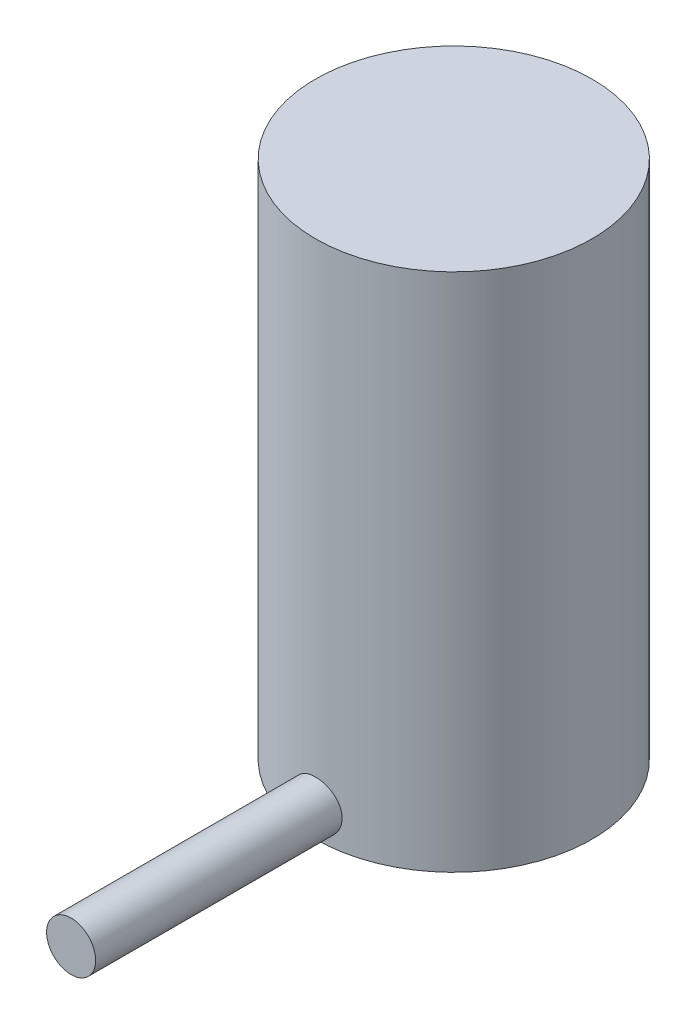
ISO-10303-21;
HEADER;
FILE_DESCRIPTION(('STEP AP214'),'2;1');
FILE_NAME('part.step','',(''),(''),'','','');
FILE_SCHEMA(('AUTOMOTIVE_DESIGN { 1 0 10303 214 1 1 1 1 }'));
ENDSEC;
DATA;
#1=APPLICATION_CONTEXT('core data for automotive mechanical design processes');
#2=APPLICATION_PROTOCOL_DEFINITION('international standard','automotive_design',2000,#1);
#3=PRODUCT_CONTEXT('',#1,'mechanical');
#4=PRODUCT('Part','Part','',(#3));
#5=PRODUCT_RELATED_PRODUCT_CATEGORY('part','',(#4));
#6=PRODUCT_DEFINITION_FORMATION('','',#4);
#7=PRODUCT_DEFINITION_CONTEXT('part definition',#1,'design');
#8=PRODUCT_DEFINITION('design','',#6,#7);
#9=PRODUCT_DEFINITION_SHAPE('','',#8);
#10=(LENGTH_UNIT() NAMED_UNIT(*) SI_UNIT(.MILLI.,.METRE.));
#11=(NAMED_UNIT(*) PLANE_ANGLE_UNIT() SI_UNIT($,.RADIAN.));
#12=(NAMED_UNIT(*) SI_UNIT($,.STERADIAN.) SOLID_ANGLE_UNIT());
#13=UNCERTAINTY_MEASURE_WITH_UNIT(LENGTH_MEASURE(1.E-05),#10,'distance_accuracy_value','');
#14=(GEOMETRIC_REPRESENTATION_CONTEXT(3) GLOBAL_UNCERTAINTY_ASSIGNED_CONTEXT((#13)) GLOBAL_UNIT_ASSIGNED_CONTEXT((#10,
#11,#12)) REPRESENTATION_CONTEXT('',''));
#15=CARTESIAN_POINT('',(0.,0.,0.));
#16=DIRECTION('',(0.,0.,1.));
#17=DIRECTION('',(1.,0.,0.));
#18=AXIS2_PLACEMENT_3D('',#15,#16,#17);
#19=CARTESIAN_POINT('',(0.,69.85,0.));
#20=DIRECTION('',(0.,-1.,0.));
#21=DIRECTION('',(0.,0.,-1.));
#22=AXIS2_PLACEMENT_3D('',#19,#20,#21);
#23=CYLINDRICAL_SURFACE('',#22,17.907);
#24=CARTESIAN_POINT('',(-3.175,6.35,17.6232807388409));
#25=CARTESIAN_POINT('',(-3.17499304653299,6.17316931234915,17.6232840588216));
#26=CARTESIAN_POINT('',(-3.16017712443954,5.9962462998669,17.6259710704368));
#27=CARTESIAN_POINT('',(-3.10133767584991,5.64737664528669,17.6364172256658));
#28=CARTESIAN_POINT('',(-3.05728828655829,5.47543455050016,17.6441808604694));
#29=CARTESIAN_POINT('',(-2.94136669140707,5.14162558179383,17.6638739499538));
#30=CARTESIAN_POINT('',(-2.86951905862502,4.97974995560714,17.6757997244788));
#31=CARTESIAN_POINT('',(-2.70010367702674,4.67036437748602,17.7024690092104));
#32=CARTESIAN_POINT('',(-2.60253838004757,4.522853057941,17.7172122507723));
#33=CARTESIAN_POINT('',(-2.38329824870293,4.24472578489295,17.7480387653565));
#34=CARTESIAN_POINT('',(-2.26139257747385,4.11429308671363,17.7641339406865));
#35=CARTESIAN_POINT('',(-1.99743106562776,3.87561974028662,17.7957453784286));
#36=CARTESIAN_POINT('',(-1.8553739690473,3.76738047630226,17.8112616046808));
#37=CARTESIAN_POINT('',(-1.55394641373776,3.57547140900495,17.8400936443133));
#38=CARTESIAN_POINT('',(-1.39446502609843,3.49197328821361,17.8533938139724));
#39=CARTESIAN_POINT('',(-1.06346376226366,3.35302149639506,17.8761623277342));
#40=CARTESIAN_POINT('',(-0.891944772257165,3.29756576339345,17.8856309535624));
#41=CARTESIAN_POINT('',(-0.543633444685128,3.21683655393841,17.8995854743215));
#42=CARTESIAN_POINT('',(-0.366914669516718,3.19125462842236,17.9041222564799));
#43=CARTESIAN_POINT('',(-0.0116389612561523,3.17003910378455,17.9078770335711));
#44=CARTESIAN_POINT('',(0.166917830155896,3.17440321333489,17.907095435441));
#45=CARTESIAN_POINT('',(0.51868889671369,3.21271731051247,17.9003415428904));
#46=CARTESIAN_POINT('',(0.69194061553601,3.24633526372394,17.8944275042702));
#47=CARTESIAN_POINT('',(1.03030433215328,3.34167877912638,17.8781383576456));
#48=CARTESIAN_POINT('',(1.19541605696335,3.40340528326307,17.8677631001421));
#49=CARTESIAN_POINT('',(1.5137882184124,3.55353690544315,17.8436189668841));
#50=CARTESIAN_POINT('',(1.66698374919448,3.64207680550016,17.8298330123166));
#51=CARTESIAN_POINT('',(1.95646773029609,3.84322287934474,17.8003956620947));
#52=CARTESIAN_POINT('',(2.09275463541591,3.95583125008002,17.7847440962067));
#53=CARTESIAN_POINT('',(2.34651726351147,4.2037534862625,17.753059225458));
#54=CARTESIAN_POINT('',(2.46370920050088,4.33935771053015,17.7370236294536));
#55=CARTESIAN_POINT('',(2.67372570594686,4.62844955837823,17.7065845193159));
#56=CARTESIAN_POINT('',(2.7665499883125,4.78193739189243,17.6921810243455));
#57=CARTESIAN_POINT('',(2.92526441219525,5.1027919496566,17.6666346364363));
#58=CARTESIAN_POINT('',(2.99111688547113,5.27017769396306,17.6554963096858));
#59=CARTESIAN_POINT('',(3.09368765152384,5.61387799299758,17.637813960262));
#60=CARTESIAN_POINT('',(3.13040887159515,5.79019164869743,17.6312694759778));
#61=CARTESIAN_POINT('',(3.1732678554583,6.14419386746262,17.6236061533231));
#62=CARTESIAN_POINT('',(3.17981173185862,6.32183175096055,17.6224152741667));
#63=CARTESIAN_POINT('',(3.16321568256925,6.6756631566073,17.6254016696905));
#64=CARTESIAN_POINT('',(3.14007706189475,6.85185674191313,17.6295787083657));
#65=CARTESIAN_POINT('',(3.06512029278095,7.19648571132991,17.642763461987));
#66=CARTESIAN_POINT('',(3.01351192219463,7.36496819502465,17.6517358279197));
#67=CARTESIAN_POINT('',(2.88330190750668,7.69089399503557,17.6734702251741));
#68=CARTESIAN_POINT('',(2.8046984600463,7.84833657300386,17.686232509667));
#69=CARTESIAN_POINT('',(2.62178291384613,8.1495116980542,17.7142744944614));
#70=CARTESIAN_POINT('',(2.51721240278218,8.29308495340304,17.7295789528698));
#71=CARTESIAN_POINT('',(2.2856826783338,8.56079261346665,17.7609098412996));
#72=CARTESIAN_POINT('',(2.15872167374103,8.68492546147473,17.7769363290059));
#73=CARTESIAN_POINT('',(1.88420838062045,8.91172858746286,17.808135180661));
#74=CARTESIAN_POINT('',(1.73642975556229,9.01412688361611,17.8232951616733));
#75=CARTESIAN_POINT('',(1.42553116004289,9.19264196648693,17.850849525764));
#76=CARTESIAN_POINT('',(1.26241173478047,9.26875968674476,17.8632440070732));
#77=CARTESIAN_POINT('',(0.92624173568632,9.39213762546823,17.8838173112094));
#78=CARTESIAN_POINT('',(0.753243080112901,9.43953580523299,17.8920162582669));
#79=CARTESIAN_POINT('',(0.401582814043976,9.50457158937726,17.9033601632873));
#80=CARTESIAN_POINT('',(0.22292173532396,9.52221198001414,17.9065055944156));
#81=CARTESIAN_POINT('',(-0.132375185143442,9.52714288628866,17.907380024155));
#82=CARTESIAN_POINT('',(-0.309005257876593,9.51484569547592,17.9051826038283));
#83=CARTESIAN_POINT('',(-0.65764100323454,9.4611478518355,17.8957697718702));
#84=CARTESIAN_POINT('',(-0.829646710480001,9.41974741695451,17.8885543978169));
#85=CARTESIAN_POINT('',(-1.16396351255006,9.30918435653392,17.8699147285705));
#86=CARTESIAN_POINT('',(-1.32628801476777,9.24006120006895,17.8584964190245));
#87=CARTESIAN_POINT('',(-1.6370978172672,9.0760624106707,17.8326921353567));
#88=CARTESIAN_POINT('',(-1.78558232374656,8.98118530182147,17.8183059911646));
#89=CARTESIAN_POINT('',(-2.06656326384237,8.76693112821744,17.7879234415525));
#90=CARTESIAN_POINT('',(-2.19882900812823,8.64725409867942,17.771908674403));
#91=CARTESIAN_POINT('',(-2.44154473212556,8.38742369228863,17.7401952842498));
#92=CARTESIAN_POINT('',(-2.55198958929934,8.24726552081045,17.7244967362547));
#93=CARTESIAN_POINT('',(-2.7487637956448,7.94909197714427,17.6950545129417));
#94=CARTESIAN_POINT('',(-2.83488969736489,7.79094063684515,17.6813277758964));
#95=CARTESIAN_POINT('',(-2.97921615492176,7.46222861581149,17.6575851819714));
#96=CARTESIAN_POINT('',(-3.03744384893703,7.29168018124584,17.6475657209828));
#97=CARTESIAN_POINT('',(-3.11207588901382,6.99212062273893,17.6345286641305));
#98=CARTESIAN_POINT('',(-3.1356333081157,6.86489482940007,17.6303349275203));
#99=CARTESIAN_POINT('',(-3.16709772991405,6.60846243751805,17.6247097823868));
#100=CARTESIAN_POINT('',(-3.17500508269539,6.47925588334876,17.623278312073));
#101=CARTESIAN_POINT('',(-3.175,6.35,17.6232807388409));
#102=B_SPLINE_CURVE_WITH_KNOTS('',3,(#24,#25,#26,#27,#28,#29,#30,#31,#32,#33,#34,#35,#36,#37,
#38,#39,#40,#41,#42,#43,#44,#45,#46,#47,#48,#49,#50,#51,#52,#53,#54,#55,#56,#57,#58,#59,#60,#61,
#62,#63,#64,#65,#66,#67,#68,#69,#70,#71,#72,#73,#74,#75,#76,#77,#78,#79,#80,#81,#82,#83,#84,#85,
#86,#87,#88,#89,#90,#91,#92,#93,#94,#95,#96,#97,#98,#99,#100,#101),.UNSPECIFIED.,.T.,.F.,(4,2,2,
2,2,2,2,2,2,2,2,2,2,2,2,2,2,2,2,2,2,2,2,2,2,2,2,2,2,2,2,2,2,2,2,2,2,2,4),(0.,0.530019229135661,
1.06050799152707,1.59052888020356,2.12049925670574,2.65575733203058,3.19104878267159,
3.72997209954094,4.26885578327559,4.80212483494151,5.33535308385586,5.86260692827193,
6.38987844279335,6.91984565289556,7.44986125858877,7.98714966876202,8.52444438674199,
9.06248694101836,9.60047542249008,10.1312023613234,10.6619059671135,11.1887503564399,
11.7156299475299,12.247979109101,12.7803708771991,13.3190762722162,13.8577625293374,
14.3938401256079,14.9298675255054,15.4585547387189,15.9872379927725,16.5151712128502,
17.043134694288,17.5779018147787,18.1127943251447,18.6520373345692,19.1907547211627,
19.5781854160868,19.9656074442645),.UNSPECIFIED.);
#103=CARTESIAN_POINT('',(-3.175,6.35,17.6232807388409));
#104=VERTEX_POINT('',#103);
#105=EDGE_CURVE('E10',#104,#104,#102,.T.);
#106=ORIENTED_EDGE('',*,*,#105,.F.);
#107=EDGE_LOOP('',(#106));
#108=FACE_BOUND('',#107,.T.);
#109=CARTESIAN_POINT('',(0.,69.85,0.));
#110=DIRECTION('',(0.,1.,0.));
#111=DIRECTION('',(0.,0.,1.));
#112=AXIS2_PLACEMENT_3D('',#109,#110,#111);
#113=CIRCLE('',#112,17.907);
#114=CARTESIAN_POINT('',(0.,69.85,17.907));
#115=VERTEX_POINT('',#114);
#116=EDGE_CURVE('E46',#115,#115,#113,.T.);
#117=ORIENTED_EDGE('',*,*,#116,.F.);
#118=EDGE_LOOP('',(#117));
#119=FACE_BOUND('',#118,.T.);
#120=CARTESIAN_POINT('',(0.,2.54,0.));
#121=DIRECTION('',(0.,-1.,0.));
#122=DIRECTION('',(0.,0.,-1.));
#123=AXIS2_PLACEMENT_3D('',#120,#121,#122);
#124=CIRCLE('',#123,17.907);
#125=CARTESIAN_POINT('',(0.,2.54,-17.907));
#126=VERTEX_POINT('',#125);
#127=EDGE_CURVE('E54',#126,#126,#124,.T.);
#128=ORIENTED_EDGE('',*,*,#127,.F.);
#129=EDGE_LOOP('',(#128));
#130=FACE_BOUND('',#129,.T.);
#131=ADVANCED_FACE('F35',(#108,#119,#130),#23,.T.);
#132=CARTESIAN_POINT('',(0.,69.85,0.));
#133=DIRECTION('',(0.,1.,0.));
#134=DIRECTION('',(0.,0.,1.));
#135=AXIS2_PLACEMENT_3D('',#132,#133,#134);
#136=PLANE('',#135);
#137=ORIENTED_EDGE('',*,*,#116,.T.);
#138=EDGE_LOOP('',(#137));
#139=FACE_BOUND('',#138,.T.);
#140=ADVANCED_FACE('F63',(#139),#136,.T.);
#141=CARTESIAN_POINT('',(0.,6.35,49.53));
#142=DIRECTION('',(0.,0.,-1.));
#143=DIRECTION('',(-1.,0.,0.));
#144=AXIS2_PLACEMENT_3D('',#141,#142,#143);
#145=CYLINDRICAL_SURFACE('',#144,3.175);
#146=CARTESIAN_POINT('',(0.,6.35,49.53));
#147=DIRECTION('',(0.,0.,1.));
#148=DIRECTION('',(1.,0.,0.));
#149=AXIS2_PLACEMENT_3D('',#146,#147,#148);
#150=CIRCLE('',#149,3.175);
#151=CARTESIAN_POINT('',(3.175,6.35,49.53));
#152=VERTEX_POINT('',#151);
#153=EDGE_CURVE('E50',#152,#152,#150,.T.);
#154=ORIENTED_EDGE('',*,*,#153,.F.);
#155=EDGE_LOOP('',(#154));
#156=FACE_BOUND('',#155,.T.);
#157=ORIENTED_EDGE('',*,*,#105,.T.);
#158=EDGE_LOOP('',(#157));
#159=FACE_BOUND('',#158,.T.);
#160=ADVANCED_FACE('F68',(#156,#159),#145,.T.);
#161=CARTESIAN_POINT('',(0.,6.35,49.53));
#162=DIRECTION('',(0.,0.,1.));
#163=DIRECTION('',(1.,0.,0.));
#164=AXIS2_PLACEMENT_3D('',#161,#162,#163);
#165=PLANE('',#164);
#166=ORIENTED_EDGE('',*,*,#153,.T.);
#167=EDGE_LOOP('',(#166));
#168=FACE_BOUND('',#167,.T.);
#169=ADVANCED_FACE('F73',(#168),#165,.T.);
#170=CARTESIAN_POINT('',(0.,2.54,0.));
#171=DIRECTION('',(0.,-1.,0.));
#172=DIRECTION('',(0.,0.,-1.));
#173=AXIS2_PLACEMENT_3D('',#170,#171,#172);
#174=PLANE('',#173);
#175=ORIENTED_EDGE('',*,*,#127,.T.);
#176=EDGE_LOOP('',(#175));
#177=FACE_BOUND('',#176,.T.);
#178=ADVANCED_FACE('F60',(#177),#174,.T.);
#179=CLOSED_SHELL('',(#131,#140,#160,#169,#178));
#180=MANIFOLD_SOLID_BREP('B2',#179);
#181=ADVANCED_BREP_SHAPE_REPRESENTATION('',(#18,#180),#14);
#182=SHAPE_DEFINITION_REPRESENTATION(#9,#181);
ENDSEC;
END-ISO-10303-21;
